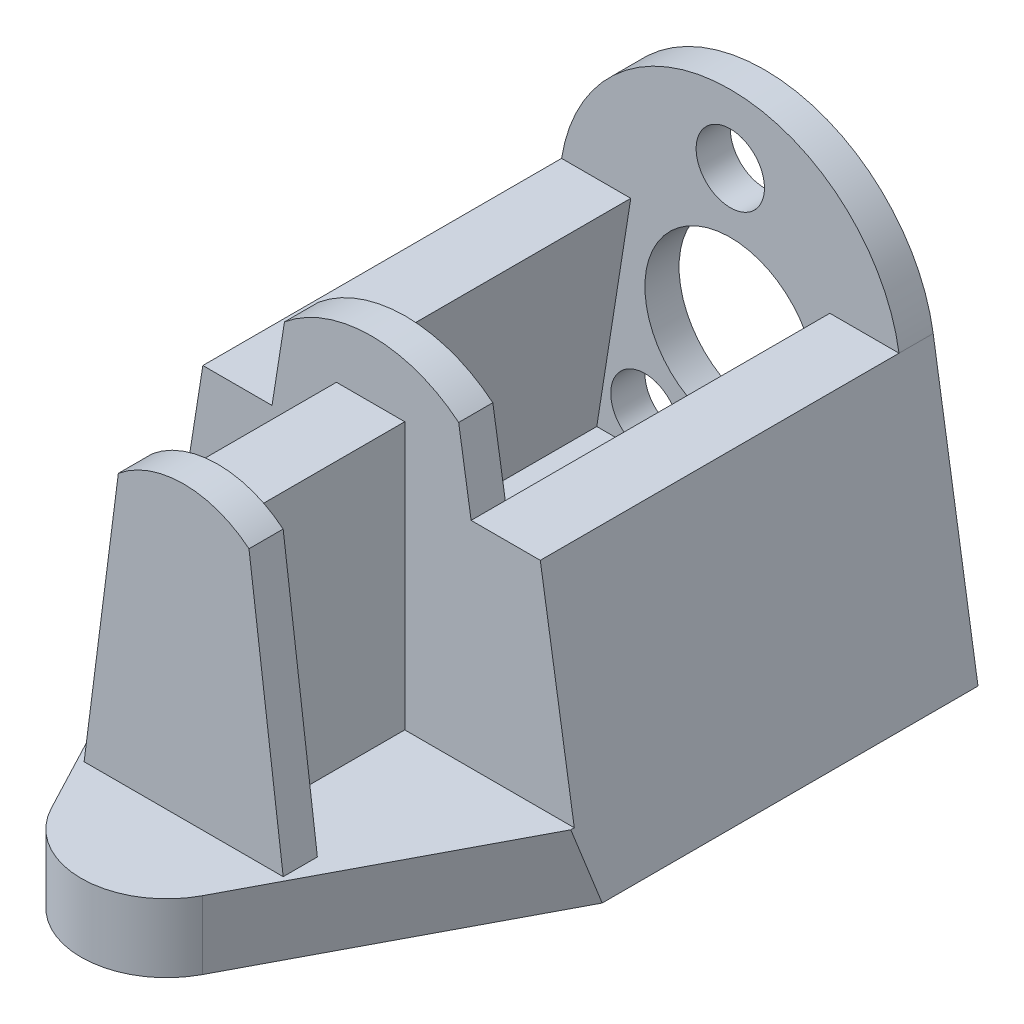
ISO-10303-21;
HEADER;
FILE_DESCRIPTION(('STEP AP214'),'2;1');
FILE_NAME('part.step','',(''),(''),'','','');
FILE_SCHEMA(('AUTOMOTIVE_DESIGN { 1 0 10303 214 1 1 1 1 }'));
ENDSEC;
DATA;
#1=APPLICATION_CONTEXT('core data for automotive mechanical design processes');
#2=APPLICATION_PROTOCOL_DEFINITION('international standard','automotive_design',2000,#1);
#3=PRODUCT_CONTEXT('',#1,'mechanical');
#4=PRODUCT('Part','Part','',(#3));
#5=PRODUCT_RELATED_PRODUCT_CATEGORY('part','',(#4));
#6=PRODUCT_DEFINITION_FORMATION('','',#4);
#7=PRODUCT_DEFINITION_CONTEXT('part definition',#1,'design');
#8=PRODUCT_DEFINITION('design','',#6,#7);
#9=PRODUCT_DEFINITION_SHAPE('','',#8);
#10=(LENGTH_UNIT() NAMED_UNIT(*) SI_UNIT(.MILLI.,.METRE.));
#11=(NAMED_UNIT(*) PLANE_ANGLE_UNIT() SI_UNIT($,.RADIAN.));
#12=(NAMED_UNIT(*) SI_UNIT($,.STERADIAN.) SOLID_ANGLE_UNIT());
#13=UNCERTAINTY_MEASURE_WITH_UNIT(LENGTH_MEASURE(1.E-05),#10,'distance_accuracy_value','');
#14=(GEOMETRIC_REPRESENTATION_CONTEXT(3) GLOBAL_UNCERTAINTY_ASSIGNED_CONTEXT((#13)) GLOBAL_UNIT_ASSIGNED_CONTEXT((#10,
#11,#12)) REPRESENTATION_CONTEXT('',''));
#15=CARTESIAN_POINT('',(0.,0.,0.));
#16=DIRECTION('',(0.,0.,1.));
#17=DIRECTION('',(1.,0.,0.));
#18=AXIS2_PLACEMENT_3D('',#15,#16,#17);
#19=CARTESIAN_POINT('',(11.8665631459995,4.,-23.3179778023443));
#20=DIRECTION('',(0.,-1.,0.));
#21=DIRECTION('',(0.,0.,-1.));
#22=AXIS2_PLACEMENT_3D('',#19,#20,#21);
#23=PLANE('',#22);
#24=DIRECTION('',(0.,0.,1.));
#25=VECTOR('',#24,1.);
#26=CARTESIAN_POINT('',(-2.05764742658131,4.,6.87245404465437));
#27=LINE('',#26,#25);
#28=CARTESIAN_POINT('',(-2.05764742658131,4.,23.));
#29=VERTEX_POINT('',#28);
#30=CARTESIAN_POINT('',(-2.05764742658131,4.,32.));
#31=VERTEX_POINT('',#30);
#32=EDGE_CURVE('E218',#29,#31,#27,.T.);
#33=ORIENTED_EDGE('',*,*,#32,.F.);
#34=DIRECTION('',(1.,0.,0.));
#35=VECTOR('',#34,1.);
#36=CARTESIAN_POINT('',(0.,4.,23.));
#37=LINE('',#36,#35);
#38=CARTESIAN_POINT('',(-11.8665631459995,4.,23.));
#39=VERTEX_POINT('',#38);
#40=EDGE_CURVE('E346',#39,#29,#37,.T.);
#41=ORIENTED_EDGE('',*,*,#40,.F.);
#42=DIRECTION('',(0.,0.,1.));
#43=VECTOR('',#42,1.);
#44=CARTESIAN_POINT('',(-11.8665631459995,4.,-23.3179778023443));
#45=LINE('',#44,#43);
#46=CARTESIAN_POINT('',(-11.8665631459995,4.,23.2023891956157));
#47=VERTEX_POINT('',#46);
#48=EDGE_CURVE('E368',#39,#47,#45,.T.);
#49=ORIENTED_EDGE('',*,*,#48,.T.);
#50=DIRECTION('',(-0.466092369375998,0.,-0.884736064151037));
#51=VECTOR('',#50,1.);
#52=CARTESIAN_POINT('',(-12.5,4.,22.));
#53=LINE('',#52,#51);
#54=CARTESIAN_POINT('',(-4.42368032075518,4.,37.33046184688));
#55=VERTEX_POINT('',#54);
#56=EDGE_CURVE('E316',#55,#47,#53,.T.);
#57=ORIENTED_EDGE('',*,*,#56,.F.);
#58=CARTESIAN_POINT('',(0.,4.,35.));
#59=DIRECTION('',(0.,-1.,0.));
#60=DIRECTION('',(0.,0.,1.));
#61=AXIS2_PLACEMENT_3D('',#58,#59,#60);
#62=CIRCLE('',#61,5.);
#63=CARTESIAN_POINT('',(4.42368032075519,4.,37.33046184688));
#64=VERTEX_POINT('',#63);
#65=EDGE_CURVE('E313',#64,#55,#62,.T.);
#66=ORIENTED_EDGE('',*,*,#65,.F.);
#67=DIRECTION('',(0.466092369375997,0.,-0.884736064151038));
#68=VECTOR('',#67,1.);
#69=CARTESIAN_POINT('',(31.0501077302335,4.,-13.2117957322425));
#70=LINE('',#69,#68);
#71=CARTESIAN_POINT('',(11.8665631459995,4.,23.2023891956157));
#72=VERTEX_POINT('',#71);
#73=EDGE_CURVE('E46',#64,#72,#70,.T.);
#74=ORIENTED_EDGE('',*,*,#73,.T.);
#75=DIRECTION('',(0.,0.,1.));
#76=VECTOR('',#75,1.);
#77=CARTESIAN_POINT('',(11.8665631459995,4.,-23.3179778023443));
#78=LINE('',#77,#76);
#79=CARTESIAN_POINT('',(11.8665631459995,4.,23.));
#80=VERTEX_POINT('',#79);
#81=EDGE_CURVE('E364',#80,#72,#78,.T.);
#82=ORIENTED_EDGE('',*,*,#81,.F.);
#83=CARTESIAN_POINT('',(1.94235257341869,4.,23.));
#84=VERTEX_POINT('',#83);
#85=EDGE_CURVE('E216',#84,#80,#37,.T.);
#86=ORIENTED_EDGE('',*,*,#85,.F.);
#87=DIRECTION('',(0.,0.,1.));
#88=VECTOR('',#87,1.);
#89=CARTESIAN_POINT('',(1.94235257341869,3.99999999999999,6.87245404465437));
#90=LINE('',#89,#88);
#91=CARTESIAN_POINT('',(1.94235257341869,3.99999999999999,32.));
#92=VERTEX_POINT('',#91);
#93=EDGE_CURVE('E214',#84,#92,#90,.T.);
#94=ORIENTED_EDGE('',*,*,#93,.T.);
#95=DIRECTION('',(1.,0.,0.));
#96=VECTOR('',#95,1.);
#97=CARTESIAN_POINT('',(0.,4.,32.));
#98=LINE('',#97,#96);
#99=CARTESIAN_POINT('',(5.82707718181981,4.,32.));
#100=VERTEX_POINT('',#99);
#101=EDGE_CURVE('E198',#92,#100,#98,.T.);
#102=ORIENTED_EDGE('',*,*,#101,.T.);
#103=DIRECTION('',(0.,0.,-1.));
#104=VECTOR('',#103,1.);
#105=CARTESIAN_POINT('',(5.82707718181981,3.99999999999999,34.));
#106=LINE('',#105,#104);
#107=CARTESIAN_POINT('',(5.8270771818198,4.,34.));
#108=VERTEX_POINT('',#107);
#109=EDGE_CURVE('E266',#108,#100,#106,.T.);
#110=ORIENTED_EDGE('',*,*,#109,.F.);
#111=DIRECTION('',(1.,0.,0.));
#112=VECTOR('',#111,1.);
#113=CARTESIAN_POINT('',(0.,4.,34.));
#114=LINE('',#113,#112);
#115=CARTESIAN_POINT('',(-5.82707718181981,4.,34.));
#116=VERTEX_POINT('',#115);
#117=EDGE_CURVE('E251',#116,#108,#114,.T.);
#118=ORIENTED_EDGE('',*,*,#117,.F.);
#119=DIRECTION('',(0.,0.,-1.));
#120=VECTOR('',#119,1.);
#121=CARTESIAN_POINT('',(-5.8270771818198,4.,34.));
#122=LINE('',#121,#120);
#123=CARTESIAN_POINT('',(-5.8270771818198,4.,32.));
#124=VERTEX_POINT('',#123);
#125=EDGE_CURVE('E268',#116,#124,#122,.T.);
#126=ORIENTED_EDGE('',*,*,#125,.T.);
#127=EDGE_CURVE('E209',#124,#31,#98,.T.);
#128=ORIENTED_EDGE('',*,*,#127,.T.);
#129=EDGE_LOOP('',(#33,#41,#49,#57,#66,#74,#82,#86,#94,#102,#110,#118,#126,#128));
#130=FACE_BOUND('',#129,.T.);
#131=ADVANCED_FACE('F38',(#130),#23,.F.);
#132=CARTESIAN_POINT('',(0.,0.,23.));
#133=DIRECTION('',(0.,0.,1.));
#134=DIRECTION('',(1.,0.,0.));
#135=AXIS2_PLACEMENT_3D('',#132,#133,#134);
#136=PLANE('',#135);
#137=ORIENTED_EDGE('',*,*,#40,.T.);
#138=DIRECTION('',(0.,-1.,0.));
#139=VECTOR('',#138,1.);
#140=CARTESIAN_POINT('',(-2.05764742658131,4.,23.));
#141=LINE('',#140,#139);
#142=CARTESIAN_POINT('',(-2.05764742658131,19.6236275730633,23.));
#143=VERTEX_POINT('',#142);
#144=EDGE_CURVE('E53',#143,#29,#141,.T.);
#145=ORIENTED_EDGE('',*,*,#144,.F.);
#146=DIRECTION('',(-1.,0.,0.));
#147=VECTOR('',#146,1.);
#148=CARTESIAN_POINT('',(-2.05764742658131,19.6236275730633,23.));
#149=LINE('',#148,#147);
#150=CARTESIAN_POINT('',(1.94235257341869,19.6236275730633,23.));
#151=VERTEX_POINT('',#150);
#152=EDGE_CURVE('E58',#151,#143,#149,.T.);
#153=ORIENTED_EDGE('',*,*,#152,.F.);
#154=DIRECTION('',(0.,1.,0.));
#155=VECTOR('',#154,1.);
#156=CARTESIAN_POINT('',(1.94235257341869,3.99999999999999,23.));
#157=LINE('',#156,#155);
#158=EDGE_CURVE('E234',#84,#151,#157,.T.);
#159=ORIENTED_EDGE('',*,*,#158,.F.);
#160=ORIENTED_EDGE('',*,*,#85,.T.);
#161=DIRECTION('',(-0.156410158401588,0.987692190081905,0.));
#162=VECTOR('',#161,1.);
#163=CARTESIAN_POINT('',(12.1941982793599,1.93106364878403,23.));
#164=LINE('',#163,#162);
#165=CARTESIAN_POINT('',(9.87692190081905,16.5641015840159,23.));
#166=VERTEX_POINT('',#165);
#167=EDGE_CURVE('E274',#80,#166,#164,.T.);
#168=ORIENTED_EDGE('',*,*,#167,.T.);
#169=DIRECTION('',(-1.,0.,0.));
#170=VECTOR('',#169,1.);
#171=CARTESIAN_POINT('',(0.,16.5641015840159,23.));
#172=LINE('',#171,#170);
#173=CARTESIAN_POINT('',(5.8270771818198,16.5641015840159,23.));
#174=VERTEX_POINT('',#173);
#175=EDGE_CURVE('E276',#166,#174,#172,.T.);
#176=ORIENTED_EDGE('',*,*,#175,.T.);
#177=DIRECTION('',(-0.156410158401588,0.987692190081905,0.));
#178=VECTOR('',#177,1.);
#179=CARTESIAN_POINT('',(8.24342951903225,1.30542301517767,23.));
#180=LINE('',#179,#178);
#181=CARTESIAN_POINT('',(5.09850837718179,21.1648367640844,23.));
#182=VERTEX_POINT('',#181);
#183=EDGE_CURVE('E338',#174,#182,#180,.T.);
#184=ORIENTED_EDGE('',*,*,#183,.T.);
#185=CARTESIAN_POINT('',(0.,15.,23.));
#186=DIRECTION('',(0.,0.,1.));
#187=DIRECTION('',(1.,0.,0.));
#188=AXIS2_PLACEMENT_3D('',#185,#186,#187);
#189=CIRCLE('',#188,8.);
#190=CARTESIAN_POINT('',(-5.09850837718179,21.1648367640844,23.));
#191=VERTEX_POINT('',#190);
#192=EDGE_CURVE('E340',#182,#191,#189,.T.);
#193=ORIENTED_EDGE('',*,*,#192,.T.);
#194=DIRECTION('',(-0.156410158401588,-0.987692190081905,0.));
#195=VECTOR('',#194,1.);
#196=CARTESIAN_POINT('',(-8.24342951903226,1.30542301517767,23.));
#197=LINE('',#196,#195);
#198=CARTESIAN_POINT('',(-5.8270771818198,16.5641015840159,23.));
#199=VERTEX_POINT('',#198);
#200=EDGE_CURVE('E343',#191,#199,#197,.T.);
#201=ORIENTED_EDGE('',*,*,#200,.T.);
#202=DIRECTION('',(1.,0.,0.));
#203=VECTOR('',#202,1.);
#204=CARTESIAN_POINT('',(0.,16.5641015840159,23.));
#205=LINE('',#204,#203);
#206=CARTESIAN_POINT('',(-9.87692190081905,16.5641015840159,23.));
#207=VERTEX_POINT('',#206);
#208=EDGE_CURVE('E293',#207,#199,#205,.T.);
#209=ORIENTED_EDGE('',*,*,#208,.F.);
#210=DIRECTION('',(-0.156410158401588,-0.987692190081905,0.));
#211=VECTOR('',#210,1.);
#212=CARTESIAN_POINT('',(-12.1941982793599,1.93106364878402,23.));
#213=LINE('',#212,#211);
#214=EDGE_CURVE('E296',#207,#39,#213,.T.);
#215=ORIENTED_EDGE('',*,*,#214,.T.);
#216=EDGE_LOOP('',(#137,#145,#153,#159,#160,#168,#176,#184,#193,#201,#209,#215));
#217=FACE_BOUND('',#216,.T.);
#218=ADVANCED_FACE('F449',(#217),#136,.T.);
#219=CARTESIAN_POINT('',(0.,0.,32.));
#220=DIRECTION('',(0.,0.,1.));
#221=DIRECTION('',(1.,0.,0.));
#222=AXIS2_PLACEMENT_3D('',#219,#220,#221);
#223=PLANE('',#222);
#224=DIRECTION('',(0.,1.,0.));
#225=VECTOR('',#224,1.);
#226=CARTESIAN_POINT('',(-2.05764742658131,4.,32.));
#227=LINE('',#226,#225);
#228=CARTESIAN_POINT('',(-2.05764742658131,19.6236275730633,32.));
#229=VERTEX_POINT('',#228);
#230=EDGE_CURVE('E224',#31,#229,#227,.T.);
#231=ORIENTED_EDGE('',*,*,#230,.F.);
#232=ORIENTED_EDGE('',*,*,#127,.F.);
#233=DIRECTION('',(-0.127174729374243,-0.991880329580433,0.));
#234=VECTOR('',#233,1.);
#235=CARTESIAN_POINT('',(-6.237401912962,0.799733472499522,32.));
#236=LINE('',#235,#234);
#237=CARTESIAN_POINT('',(-3.82388128288634,19.6236275730633,32.));
#238=VERTEX_POINT('',#237);
#239=EDGE_CURVE('E210',#238,#124,#236,.T.);
#240=ORIENTED_EDGE('',*,*,#239,.F.);
#241=CARTESIAN_POINT('',(0.,15.,32.));
#242=DIRECTION('',(0.,0.,1.));
#243=DIRECTION('',(1.,0.,0.));
#244=AXIS2_PLACEMENT_3D('',#241,#242,#243);
#245=CIRCLE('',#244,6.);
#246=CARTESIAN_POINT('',(3.82388128288634,19.6236275730633,32.));
#247=VERTEX_POINT('',#246);
#248=EDGE_CURVE('E258',#247,#238,#245,.T.);
#249=ORIENTED_EDGE('',*,*,#248,.F.);
#250=DIRECTION('',(0.127174729374243,-0.991880329580433,0.));
#251=VECTOR('',#250,1.);
#252=CARTESIAN_POINT('',(6.237401912962,0.799733472499522,32.));
#253=LINE('',#252,#251);
#254=EDGE_CURVE('E206',#247,#100,#253,.T.);
#255=ORIENTED_EDGE('',*,*,#254,.T.);
#256=ORIENTED_EDGE('',*,*,#101,.F.);
#257=DIRECTION('',(0.,-1.,0.));
#258=VECTOR('',#257,1.);
#259=CARTESIAN_POINT('',(1.94235257341869,3.99999999999999,32.));
#260=LINE('',#259,#258);
#261=CARTESIAN_POINT('',(1.94235257341869,19.6236275730633,32.));
#262=VERTEX_POINT('',#261);
#263=EDGE_CURVE('E202',#262,#92,#260,.T.);
#264=ORIENTED_EDGE('',*,*,#263,.F.);
#265=DIRECTION('',(1.,0.,0.));
#266=VECTOR('',#265,1.);
#267=CARTESIAN_POINT('',(-2.05764742658131,19.6236275730633,32.));
#268=LINE('',#267,#266);
#269=EDGE_CURVE('E228',#229,#262,#268,.T.);
#270=ORIENTED_EDGE('',*,*,#269,.F.);
#271=EDGE_LOOP('',(#231,#232,#240,#249,#255,#256,#264,#270));
#272=FACE_BOUND('',#271,.T.);
#273=ADVANCED_FACE('F200',(#272),#223,.F.);
#274=DIRECTION('',(1.,0.,0.));
#275=VECTOR('',#274,1.);
#276=CARTESIAN_POINT('',(0.,4.,21.));
#277=LINE('',#276,#275);
#278=CARTESIAN_POINT('',(-7.81671842700026,4.,21.));
#279=VERTEX_POINT('',#278);
#280=CARTESIAN_POINT('',(7.81671842700025,4.,21.));
#281=VERTEX_POINT('',#280);
#282=EDGE_CURVE('E341',#279,#281,#277,.T.);
#283=ORIENTED_EDGE('',*,*,#282,.T.);
#284=DIRECTION('',(0.,0.,-1.));
#285=VECTOR('',#284,1.);
#286=CARTESIAN_POINT('',(7.81671842700024,4.,23.));
#287=LINE('',#286,#285);
#288=CARTESIAN_POINT('',(7.81671842700025,4.,2.));
#289=VERTEX_POINT('',#288);
#290=EDGE_CURVE('E290',#281,#289,#287,.T.);
#291=ORIENTED_EDGE('',*,*,#290,.T.);
#292=DIRECTION('',(-1.,0.,0.));
#293=VECTOR('',#292,1.);
#294=CARTESIAN_POINT('',(11.8665631459995,4.,2.));
#295=LINE('',#294,#293);
#296=CARTESIAN_POINT('',(-7.81671842700026,4.,2.));
#297=VERTEX_POINT('',#296);
#298=EDGE_CURVE('E365',#289,#297,#295,.T.);
#299=ORIENTED_EDGE('',*,*,#298,.T.);
#300=DIRECTION('',(0.,0.,-1.));
#301=VECTOR('',#300,1.);
#302=CARTESIAN_POINT('',(-7.81671842700026,4.,23.));
#303=LINE('',#302,#301);
#304=EDGE_CURVE('E307',#279,#297,#303,.T.);
#305=ORIENTED_EDGE('',*,*,#304,.F.);
#306=EDGE_LOOP('',(#283,#291,#299,#305));
#307=FACE_BOUND('',#306,.T.);
#308=ADVANCED_FACE('F477',(#307),#23,.F.);
#309=CARTESIAN_POINT('',(8.24342951903225,1.30542301517767,23.));
#310=DIRECTION('',(-0.987692190081905,-0.156410158401588,0.));
#311=DIRECTION('',(0.156410158401588,-0.987692190081905,0.));
#312=AXIS2_PLACEMENT_3D('',#309,#310,#311);
#313=PLANE('',#312);
#314=DIRECTION('',(0.,0.,-1.));
#315=VECTOR('',#314,1.);
#316=CARTESIAN_POINT('',(5.8270771818198,16.5641015840159,23.));
#317=LINE('',#316,#315);
#318=CARTESIAN_POINT('',(5.8270771818198,16.5641015840159,21.));
#319=VERTEX_POINT('',#318);
#320=EDGE_CURVE('E284',#174,#319,#317,.T.);
#321=ORIENTED_EDGE('',*,*,#320,.T.);
#322=DIRECTION('',(-0.156410158401588,0.987692190081905,0.));
#323=VECTOR('',#322,1.);
#324=CARTESIAN_POINT('',(8.24342951903225,1.30542301517767,21.));
#325=LINE('',#324,#323);
#326=CARTESIAN_POINT('',(5.09850837718179,21.1648367640844,21.));
#327=VERTEX_POINT('',#326);
#328=EDGE_CURVE('E337',#319,#327,#325,.T.);
#329=ORIENTED_EDGE('',*,*,#328,.T.);
#330=DIRECTION('',(0.,0.,-1.));
#331=VECTOR('',#330,1.);
#332=CARTESIAN_POINT('',(5.09850837718179,21.1648367640844,23.));
#333=LINE('',#332,#331);
#334=EDGE_CURVE('E361',#182,#327,#333,.T.);
#335=ORIENTED_EDGE('',*,*,#334,.F.);
#336=ORIENTED_EDGE('',*,*,#183,.F.);
#337=EDGE_LOOP('',(#321,#329,#335,#336));
#338=FACE_BOUND('',#337,.T.);
#339=ADVANCED_FACE('F485',(#338),#313,.F.);
#340=CARTESIAN_POINT('',(0.,15.,2.));
#341=DIRECTION('',(0.,0.,-1.));
#342=DIRECTION('',(-1.,0.,0.));
#343=AXIS2_PLACEMENT_3D('',#340,#341,#342);
#344=CYLINDRICAL_SURFACE('',#343,10.);
#345=CARTESIAN_POINT('',(0.,15.,0.));
#346=DIRECTION('',(0.,0.,1.));
#347=DIRECTION('',(1.,0.,0.));
#348=AXIS2_PLACEMENT_3D('',#345,#346,#347);
#349=CIRCLE('',#348,10.);
#350=CARTESIAN_POINT('',(9.87692190081905,16.5641015840159,0.));
#351=VERTEX_POINT('',#350);
#352=CARTESIAN_POINT('',(-9.87692190081905,16.5641015840159,0.));
#353=VERTEX_POINT('',#352);
#354=EDGE_CURVE('E389',#351,#353,#349,.T.);
#355=ORIENTED_EDGE('',*,*,#354,.T.);
#356=DIRECTION('',(0.,0.,-1.));
#357=VECTOR('',#356,1.);
#358=CARTESIAN_POINT('',(-9.87692190081905,16.5641015840159,2.));
#359=LINE('',#358,#357);
#360=CARTESIAN_POINT('',(-9.87692190081905,16.5641015840159,2.));
#361=VERTEX_POINT('',#360);
#362=EDGE_CURVE('E414',#361,#353,#359,.T.);
#363=ORIENTED_EDGE('',*,*,#362,.F.);
#364=CARTESIAN_POINT('',(0.,15.,2.));
#365=DIRECTION('',(0.,0.,1.));
#366=DIRECTION('',(1.,0.,0.));
#367=AXIS2_PLACEMENT_3D('',#364,#365,#366);
#368=CIRCLE('',#367,10.);
#369=CARTESIAN_POINT('',(9.87692190081905,16.5641015840159,2.));
#370=VERTEX_POINT('',#369);
#371=EDGE_CURVE('E374',#370,#361,#368,.T.);
#372=ORIENTED_EDGE('',*,*,#371,.F.);
#373=DIRECTION('',(0.,0.,-1.));
#374=VECTOR('',#373,1.);
#375=CARTESIAN_POINT('',(9.87692190081905,16.5641015840159,2.));
#376=LINE('',#375,#374);
#377=EDGE_CURVE('E386',#370,#351,#376,.T.);
#378=ORIENTED_EDGE('',*,*,#377,.T.);
#379=EDGE_LOOP('',(#355,#363,#372,#378));
#380=FACE_BOUND('',#379,.T.);
#381=ADVANCED_FACE('F441',(#380),#344,.T.);
#382=CARTESIAN_POINT('',(-12.1941982793599,1.93106364878402,2.));
#383=DIRECTION('',(-0.987692190081905,0.156410158401588,0.));
#384=DIRECTION('',(-0.156410158401588,-0.987692190081905,0.));
#385=AXIS2_PLACEMENT_3D('',#382,#383,#384);
#386=PLANE('',#385);
#387=DIRECTION('',(0.,0.,-1.));
#388=VECTOR('',#387,1.);
#389=CARTESIAN_POINT('',(-9.87692190081905,16.5641015840159,23.));
#390=LINE('',#389,#388);
#391=EDGE_CURVE('E310',#207,#361,#390,.T.);
#392=ORIENTED_EDGE('',*,*,#391,.T.);
#393=ORIENTED_EDGE('',*,*,#362,.T.);
#394=DIRECTION('',(0.156410158401588,0.987692190081905,0.));
#395=VECTOR('',#394,1.);
#396=CARTESIAN_POINT('',(-12.1941982793599,1.93106364878402,0.));
#397=LINE('',#396,#395);
#398=CARTESIAN_POINT('',(-12.5,0.,0.));
#399=VERTEX_POINT('',#398);
#400=EDGE_CURVE('E392',#399,#353,#397,.T.);
#401=ORIENTED_EDGE('',*,*,#400,.F.);
#402=DIRECTION('',(0.,0.,-1.));
#403=VECTOR('',#402,1.);
#404=CARTESIAN_POINT('',(-12.5,0.,2.));
#405=LINE('',#404,#403);
#406=CARTESIAN_POINT('',(-12.5,0.,22.));
#407=VERTEX_POINT('',#406);
#408=EDGE_CURVE('E412',#407,#399,#405,.T.);
#409=ORIENTED_EDGE('',*,*,#408,.F.);
#410=DIRECTION('',(-0.149941183461306,-0.946842183332683,-0.2846182027981));
#411=VECTOR('',#410,1.);
#412=CARTESIAN_POINT('',(-13.0724903220213,-3.61513744207168,20.9132994497468));
#413=LINE('',#412,#411);
#414=EDGE_CURVE('E335',#47,#407,#413,.T.);
#415=ORIENTED_EDGE('',*,*,#414,.F.);
#416=ORIENTED_EDGE('',*,*,#48,.F.);
#417=ORIENTED_EDGE('',*,*,#214,.F.);
#418=EDGE_LOOP('',(#392,#393,#401,#409,#415,#416,#417));
#419=FACE_BOUND('',#418,.T.);
#420=ADVANCED_FACE('F528',(#419),#386,.T.);
#421=CARTESIAN_POINT('',(0.,0.,2.));
#422=DIRECTION('',(0.,1.,0.));
#423=DIRECTION('',(0.,0.,1.));
#424=AXIS2_PLACEMENT_3D('',#421,#422,#423);
#425=PLANE('',#424);
#426=CARTESIAN_POINT('',(0.,0.,10.));
#427=DIRECTION('',(0.,1.,0.));
#428=DIRECTION('',(0.,0.,1.));
#429=AXIS2_PLACEMENT_3D('',#426,#427,#428);
#430=CIRCLE('',#429,5.);
#431=CARTESIAN_POINT('',(0.,0.,15.));
#432=VERTEX_POINT('',#431);
#433=EDGE_CURVE('E11',#432,#432,#430,.F.);
#434=ORIENTED_EDGE('',*,*,#433,.F.);
#435=EDGE_LOOP('',(#434));
#436=FACE_BOUND('',#435,.T.);
#437=CARTESIAN_POINT('',(0.,0.,35.));
#438=DIRECTION('',(0.,1.,0.));
#439=DIRECTION('',(0.,0.,1.));
#440=AXIS2_PLACEMENT_3D('',#437,#438,#439);
#441=CIRCLE('',#440,5.);
#442=CARTESIAN_POINT('',(4.42368032075519,0.,37.33046184688));
#443=VERTEX_POINT('',#442);
#444=CARTESIAN_POINT('',(-4.42368032075518,0.,37.33046184688));
#445=VERTEX_POINT('',#444);
#446=EDGE_CURVE('E329',#443,#445,#441,.F.);
#447=ORIENTED_EDGE('',*,*,#446,.T.);
#448=DIRECTION('',(-0.466092369375998,0.,-0.884736064151038));
#449=VECTOR('',#448,1.);
#450=CARTESIAN_POINT('',(-18.0318483583694,0.,11.4994510409675));
#451=LINE('',#450,#449);
#452=EDGE_CURVE('E332',#445,#407,#451,.T.);
#453=ORIENTED_EDGE('',*,*,#452,.T.);
#454=ORIENTED_EDGE('',*,*,#408,.T.);
#455=DIRECTION('',(1.,0.,0.));
#456=VECTOR('',#455,1.);
#457=CARTESIAN_POINT('',(0.,0.,0.));
#458=LINE('',#457,#456);
#459=CARTESIAN_POINT('',(12.5,0.,0.));
#460=VERTEX_POINT('',#459);
#461=EDGE_CURVE('E395',#399,#460,#458,.T.);
#462=ORIENTED_EDGE('',*,*,#461,.T.);
#463=DIRECTION('',(0.,0.,-1.));
#464=VECTOR('',#463,1.);
#465=CARTESIAN_POINT('',(12.5,0.,2.));
#466=LINE('',#465,#464);
#467=CARTESIAN_POINT('',(12.5,0.,22.));
#468=VERTEX_POINT('',#467);
#469=EDGE_CURVE('E410',#468,#460,#466,.T.);
#470=ORIENTED_EDGE('',*,*,#469,.F.);
#471=DIRECTION('',(-0.466092369375997,0.,0.884736064151038));
#472=VECTOR('',#471,1.);
#473=CARTESIAN_POINT('',(18.0318483583694,0.,11.4994510409675));
#474=LINE('',#473,#472);
#475=EDGE_CURVE('E326',#468,#443,#474,.T.);
#476=ORIENTED_EDGE('',*,*,#475,.T.);
#477=EDGE_LOOP('',(#447,#453,#454,#462,#470,#476));
#478=FACE_BOUND('',#477,.T.);
#479=ADVANCED_FACE('F429',(#436,#478),#425,.F.);
#480=CARTESIAN_POINT('',(0.,21.,2.));
#481=DIRECTION('',(0.,0.,-1.));
#482=DIRECTION('',(-1.,0.,0.));
#483=AXIS2_PLACEMENT_3D('',#480,#481,#482);
#484=CYLINDRICAL_SURFACE('',#483,2.);
#485=CARTESIAN_POINT('',(0.,21.,2.));
#486=DIRECTION('',(0.,0.,1.));
#487=DIRECTION('',(1.,0.,0.));
#488=AXIS2_PLACEMENT_3D('',#485,#486,#487);
#489=CIRCLE('',#488,2.);
#490=CARTESIAN_POINT('',(2.,21.,2.));
#491=VERTEX_POINT('',#490);
#492=EDGE_CURVE('E380',#491,#491,#489,.T.);
#493=ORIENTED_EDGE('',*,*,#492,.T.);
#494=EDGE_LOOP('',(#493));
#495=FACE_BOUND('',#494,.T.);
#496=CARTESIAN_POINT('',(0.,21.,0.));
#497=DIRECTION('',(0.,0.,1.));
#498=DIRECTION('',(1.,0.,0.));
#499=AXIS2_PLACEMENT_3D('',#496,#497,#498);
#500=CIRCLE('',#499,2.);
#501=CARTESIAN_POINT('',(2.,21.,0.));
#502=VERTEX_POINT('',#501);
#503=EDGE_CURVE('E403',#502,#502,#500,.T.);
#504=ORIENTED_EDGE('',*,*,#503,.F.);
#505=EDGE_LOOP('',(#504));
#506=FACE_BOUND('',#505,.T.);
#507=ADVANCED_FACE('F592',(#495,#506),#484,.F.);
#508=CARTESIAN_POINT('',(5.,6.1,2.));
#509=DIRECTION('',(0.,0.,-1.));
#510=DIRECTION('',(-1.,0.,0.));
#511=AXIS2_PLACEMENT_3D('',#508,#509,#510);
#512=CYLINDRICAL_SURFACE('',#511,2.);
#513=CARTESIAN_POINT('',(5.,6.1,2.));
#514=DIRECTION('',(0.,0.,1.));
#515=DIRECTION('',(1.,0.,0.));
#516=AXIS2_PLACEMENT_3D('',#513,#514,#515);
#517=CIRCLE('',#516,2.);
#518=CARTESIAN_POINT('',(7.,6.1,2.));
#519=VERTEX_POINT('',#518);
#520=EDGE_CURVE('E377',#519,#519,#517,.T.);
#521=ORIENTED_EDGE('',*,*,#520,.T.);
#522=EDGE_LOOP('',(#521));
#523=FACE_BOUND('',#522,.T.);
#524=CARTESIAN_POINT('',(5.,6.1,0.));
#525=DIRECTION('',(0.,0.,1.));
#526=DIRECTION('',(1.,0.,0.));
#527=AXIS2_PLACEMENT_3D('',#524,#525,#526);
#528=CIRCLE('',#527,2.);
#529=CARTESIAN_POINT('',(7.,6.1,0.));
#530=VERTEX_POINT('',#529);
#531=EDGE_CURVE('E400',#530,#530,#528,.T.);
#532=ORIENTED_EDGE('',*,*,#531,.F.);
#533=EDGE_LOOP('',(#532));
#534=FACE_BOUND('',#533,.T.);
#535=ADVANCED_FACE('F595',(#523,#534),#512,.F.);
#536=CARTESIAN_POINT('',(12.1941982793599,1.93106364878403,2.));
#537=DIRECTION('',(-0.987692190081905,-0.156410158401588,0.));
#538=DIRECTION('',(0.156410158401588,-0.987692190081905,0.));
#539=AXIS2_PLACEMENT_3D('',#536,#537,#538);
#540=PLANE('',#539);
#541=ORIENTED_EDGE('',*,*,#377,.F.);
#542=DIRECTION('',(0.,0.,-1.));
#543=VECTOR('',#542,1.);
#544=CARTESIAN_POINT('',(9.87692190081905,16.5641015840159,23.));
#545=LINE('',#544,#543);
#546=EDGE_CURVE('E287',#166,#370,#545,.T.);
#547=ORIENTED_EDGE('',*,*,#546,.F.);
#548=ORIENTED_EDGE('',*,*,#167,.F.);
#549=ORIENTED_EDGE('',*,*,#81,.T.);
#550=DIRECTION('',(0.149941183461306,-0.946842183332683,-0.284618202798101));
#551=VECTOR('',#550,1.);
#552=CARTESIAN_POINT('',(13.0724903220213,-3.61513744207169,20.9132994497468));
#553=LINE('',#552,#551);
#554=EDGE_CURVE('E322',#72,#468,#553,.T.);
#555=ORIENTED_EDGE('',*,*,#554,.T.);
#556=ORIENTED_EDGE('',*,*,#469,.T.);
#557=DIRECTION('',(-0.156410158401588,0.987692190081905,0.));
#558=VECTOR('',#557,1.);
#559=CARTESIAN_POINT('',(12.1941982793599,1.93106364878403,0.));
#560=LINE('',#559,#558);
#561=EDGE_CURVE('E398',#460,#351,#560,.T.);
#562=ORIENTED_EDGE('',*,*,#561,.T.);
#563=EDGE_LOOP('',(#541,#547,#548,#549,#555,#556,#562));
#564=FACE_BOUND('',#563,.T.);
#565=ADVANCED_FACE('F427',(#564),#540,.F.);
#566=CARTESIAN_POINT('',(0.,12.5,2.));
#567=DIRECTION('',(0.,0.,-1.));
#568=DIRECTION('',(-1.,0.,0.));
#569=AXIS2_PLACEMENT_3D('',#566,#567,#568);
#570=CYLINDRICAL_SURFACE('',#569,5.);
#571=CARTESIAN_POINT('',(0.,12.5,2.));
#572=DIRECTION('',(0.,0.,1.));
#573=DIRECTION('',(1.,0.,0.));
#574=AXIS2_PLACEMENT_3D('',#571,#572,#573);
#575=CIRCLE('',#574,5.);
#576=CARTESIAN_POINT('',(5.,12.5,2.));
#577=VERTEX_POINT('',#576);
#578=EDGE_CURVE('E371',#577,#577,#575,.T.);
#579=ORIENTED_EDGE('',*,*,#578,.T.);
#580=EDGE_LOOP('',(#579));
#581=FACE_BOUND('',#580,.T.);
#582=CARTESIAN_POINT('',(0.,12.5,0.));
#583=DIRECTION('',(0.,0.,1.));
#584=DIRECTION('',(1.,0.,0.));
#585=AXIS2_PLACEMENT_3D('',#582,#583,#584);
#586=CIRCLE('',#585,5.);
#587=CARTESIAN_POINT('',(5.,12.5,0.));
#588=VERTEX_POINT('',#587);
#589=EDGE_CURVE('E367',#588,#588,#586,.T.);
#590=ORIENTED_EDGE('',*,*,#589,.F.);
#591=EDGE_LOOP('',(#590));
#592=FACE_BOUND('',#591,.T.);
#593=ADVANCED_FACE('F40',(#581,#592),#570,.F.);
#594=CARTESIAN_POINT('',(-5.,6.1,2.));
#595=DIRECTION('',(0.,0.,-1.));
#596=DIRECTION('',(-1.,0.,0.));
#597=AXIS2_PLACEMENT_3D('',#594,#595,#596);
#598=CYLINDRICAL_SURFACE('',#597,2.);
#599=CARTESIAN_POINT('',(-5.,6.1,2.));
#600=DIRECTION('',(0.,0.,1.));
#601=DIRECTION('',(1.,0.,0.));
#602=AXIS2_PLACEMENT_3D('',#599,#600,#601);
#603=CIRCLE('',#602,2.);
#604=CARTESIAN_POINT('',(-3.,6.1,2.));
#605=VERTEX_POINT('',#604);
#606=EDGE_CURVE('E383',#605,#605,#603,.T.);
#607=ORIENTED_EDGE('',*,*,#606,.T.);
#608=EDGE_LOOP('',(#607));
#609=FACE_BOUND('',#608,.T.);
#610=CARTESIAN_POINT('',(-5.,6.1,0.));
#611=DIRECTION('',(0.,0.,1.));
#612=DIRECTION('',(1.,0.,0.));
#613=AXIS2_PLACEMENT_3D('',#610,#611,#612);
#614=CIRCLE('',#613,2.);
#615=CARTESIAN_POINT('',(-3.,6.1,0.));
#616=VERTEX_POINT('',#615);
#617=EDGE_CURVE('E375',#616,#616,#614,.T.);
#618=ORIENTED_EDGE('',*,*,#617,.F.);
#619=EDGE_LOOP('',(#618));
#620=FACE_BOUND('',#619,.T.);
#621=ADVANCED_FACE('F587',(#609,#620),#598,.F.);
#622=CARTESIAN_POINT('',(0.,0.,2.));
#623=DIRECTION('',(0.,0.,1.));
#624=DIRECTION('',(1.,0.,0.));
#625=AXIS2_PLACEMENT_3D('',#622,#623,#624);
#626=PLANE('',#625);
#627=DIRECTION('',(-0.156410158401588,0.987692190081905,0.));
#628=VECTOR('',#627,1.);
#629=CARTESIAN_POINT('',(8.24342951903225,1.30542301517767,2.));
#630=LINE('',#629,#628);
#631=CARTESIAN_POINT('',(5.8270771818198,16.5641015840159,2.));
#632=VERTEX_POINT('',#631);
#633=EDGE_CURVE('E273',#289,#632,#630,.T.);
#634=ORIENTED_EDGE('',*,*,#633,.T.);
#635=DIRECTION('',(-1.,0.,0.));
#636=VECTOR('',#635,1.);
#637=CARTESIAN_POINT('',(0.,16.5641015840159,2.));
#638=LINE('',#637,#636);
#639=EDGE_CURVE('E277',#370,#632,#638,.T.);
#640=ORIENTED_EDGE('',*,*,#639,.F.);
#641=ORIENTED_EDGE('',*,*,#371,.T.);
#642=DIRECTION('',(1.,0.,0.));
#643=VECTOR('',#642,1.);
#644=CARTESIAN_POINT('',(0.,16.5641015840159,2.));
#645=LINE('',#644,#643);
#646=CARTESIAN_POINT('',(-5.82707718181981,16.5641015840159,2.));
#647=VERTEX_POINT('',#646);
#648=EDGE_CURVE('E292',#361,#647,#645,.T.);
#649=ORIENTED_EDGE('',*,*,#648,.T.);
#650=DIRECTION('',(-0.156410158401588,-0.987692190081905,0.));
#651=VECTOR('',#650,1.);
#652=CARTESIAN_POINT('',(-8.24342951903226,1.30542301517768,2.));
#653=LINE('',#652,#651);
#654=EDGE_CURVE('E297',#647,#297,#653,.T.);
#655=ORIENTED_EDGE('',*,*,#654,.T.);
#656=ORIENTED_EDGE('',*,*,#298,.F.);
#657=EDGE_LOOP('',(#634,#640,#641,#649,#655,#656));
#658=FACE_BOUND('',#657,.T.);
#659=ORIENTED_EDGE('',*,*,#578,.F.);
#660=EDGE_LOOP('',(#659));
#661=FACE_BOUND('',#660,.T.);
#662=ORIENTED_EDGE('',*,*,#520,.F.);
#663=EDGE_LOOP('',(#662));
#664=FACE_BOUND('',#663,.T.);
#665=ORIENTED_EDGE('',*,*,#492,.F.);
#666=EDGE_LOOP('',(#665));
#667=FACE_BOUND('',#666,.T.);
#668=ORIENTED_EDGE('',*,*,#606,.F.);
#669=EDGE_LOOP('',(#668));
#670=FACE_BOUND('',#669,.T.);
#671=ADVANCED_FACE('F505',(#658,#661,#664,#667,#670),#626,.T.);
#672=CARTESIAN_POINT('',(0.,0.,0.));
#673=DIRECTION('',(0.,0.,1.));
#674=DIRECTION('',(1.,0.,0.));
#675=AXIS2_PLACEMENT_3D('',#672,#673,#674);
#676=PLANE('',#675);
#677=ORIENTED_EDGE('',*,*,#589,.T.);
#678=EDGE_LOOP('',(#677));
#679=FACE_BOUND('',#678,.T.);
#680=ORIENTED_EDGE('',*,*,#354,.F.);
#681=ORIENTED_EDGE('',*,*,#561,.F.);
#682=ORIENTED_EDGE('',*,*,#461,.F.);
#683=ORIENTED_EDGE('',*,*,#400,.T.);
#684=EDGE_LOOP('',(#680,#681,#682,#683));
#685=FACE_BOUND('',#684,.T.);
#686=ORIENTED_EDGE('',*,*,#531,.T.);
#687=EDGE_LOOP('',(#686));
#688=FACE_BOUND('',#687,.T.);
#689=ORIENTED_EDGE('',*,*,#503,.T.);
#690=EDGE_LOOP('',(#689));
#691=FACE_BOUND('',#690,.T.);
#692=ORIENTED_EDGE('',*,*,#617,.T.);
#693=EDGE_LOOP('',(#692));
#694=FACE_BOUND('',#693,.T.);
#695=ADVANCED_FACE('F436',(#679,#685,#688,#691,#694),#676,.F.);
#696=CARTESIAN_POINT('',(0.,15.,23.));
#697=DIRECTION('',(0.,0.,-1.));
#698=DIRECTION('',(-1.,0.,0.));
#699=AXIS2_PLACEMENT_3D('',#696,#697,#698);
#700=CYLINDRICAL_SURFACE('',#699,8.);
#701=CARTESIAN_POINT('',(0.,15.,21.));
#702=DIRECTION('',(0.,0.,1.));
#703=DIRECTION('',(1.,0.,0.));
#704=AXIS2_PLACEMENT_3D('',#701,#702,#703);
#705=CIRCLE('',#704,8.);
#706=CARTESIAN_POINT('',(-5.09850837718179,21.1648367640844,21.));
#707=VERTEX_POINT('',#706);
#708=EDGE_CURVE('E352',#327,#707,#705,.T.);
#709=ORIENTED_EDGE('',*,*,#708,.T.);
#710=DIRECTION('',(0.,0.,-1.));
#711=VECTOR('',#710,1.);
#712=CARTESIAN_POINT('',(-5.09850837718179,21.1648367640844,23.));
#713=LINE('',#712,#711);
#714=EDGE_CURVE('E348',#191,#707,#713,.T.);
#715=ORIENTED_EDGE('',*,*,#714,.F.);
#716=ORIENTED_EDGE('',*,*,#192,.F.);
#717=ORIENTED_EDGE('',*,*,#334,.T.);
#718=EDGE_LOOP('',(#709,#715,#716,#717));
#719=FACE_BOUND('',#718,.T.);
#720=ADVANCED_FACE('F520',(#719),#700,.T.);
#721=CARTESIAN_POINT('',(-8.24342951903226,1.30542301517767,23.));
#722=DIRECTION('',(0.987692190081905,-0.156410158401588,0.));
#723=DIRECTION('',(0.156410158401588,0.987692190081905,0.));
#724=AXIS2_PLACEMENT_3D('',#721,#722,#723);
#725=PLANE('',#724);
#726=DIRECTION('',(-0.156410158401588,-0.987692190081905,0.));
#727=VECTOR('',#726,1.);
#728=CARTESIAN_POINT('',(-8.24342951903226,1.30542301517767,21.));
#729=LINE('',#728,#727);
#730=CARTESIAN_POINT('',(-5.8270771818198,16.5641015840159,21.));
#731=VERTEX_POINT('',#730);
#732=EDGE_CURVE('E355',#707,#731,#729,.T.);
#733=ORIENTED_EDGE('',*,*,#732,.T.);
#734=DIRECTION('',(0.,0.,-1.));
#735=VECTOR('',#734,1.);
#736=CARTESIAN_POINT('',(-5.82707718181981,16.5641015840159,23.));
#737=LINE('',#736,#735);
#738=EDGE_CURVE('E304',#199,#731,#737,.T.);
#739=ORIENTED_EDGE('',*,*,#738,.F.);
#740=ORIENTED_EDGE('',*,*,#200,.F.);
#741=ORIENTED_EDGE('',*,*,#714,.T.);
#742=EDGE_LOOP('',(#733,#739,#740,#741));
#743=FACE_BOUND('',#742,.T.);
#744=ADVANCED_FACE('F515',(#743),#725,.F.);
#745=CARTESIAN_POINT('',(0.,0.,21.));
#746=DIRECTION('',(0.,0.,1.));
#747=DIRECTION('',(1.,0.,0.));
#748=AXIS2_PLACEMENT_3D('',#745,#746,#747);
#749=PLANE('',#748);
#750=EDGE_CURVE('E349',#281,#319,#325,.T.);
#751=ORIENTED_EDGE('',*,*,#750,.F.);
#752=ORIENTED_EDGE('',*,*,#282,.F.);
#753=EDGE_CURVE('E354',#731,#279,#729,.T.);
#754=ORIENTED_EDGE('',*,*,#753,.F.);
#755=ORIENTED_EDGE('',*,*,#732,.F.);
#756=ORIENTED_EDGE('',*,*,#708,.F.);
#757=ORIENTED_EDGE('',*,*,#328,.F.);
#758=EDGE_LOOP('',(#751,#752,#754,#755,#756,#757));
#759=FACE_BOUND('',#758,.T.);
#760=ADVANCED_FACE('F499',(#759),#749,.F.);
#761=CARTESIAN_POINT('',(-12.5,-32.,22.));
#762=DIRECTION('',(0.884736064151037,0.,-0.466092369375998));
#763=DIRECTION('',(-0.466092369375998,0.,-0.884736064151038));
#764=AXIS2_PLACEMENT_3D('',#761,#762,#763);
#765=PLANE('',#764);
#766=ORIENTED_EDGE('',*,*,#414,.T.);
#767=ORIENTED_EDGE('',*,*,#452,.F.);
#768=DIRECTION('',(0.,1.,0.));
#769=VECTOR('',#768,1.);
#770=CARTESIAN_POINT('',(-4.42368032075518,-32.,37.33046184688));
#771=LINE('',#770,#769);
#772=EDGE_CURVE('E320',#445,#55,#771,.T.);
#773=ORIENTED_EDGE('',*,*,#772,.T.);
#774=ORIENTED_EDGE('',*,*,#56,.T.);
#775=EDGE_LOOP('',(#766,#767,#773,#774));
#776=FACE_BOUND('',#775,.T.);
#777=ADVANCED_FACE('F564',(#776),#765,.F.);
#778=CARTESIAN_POINT('',(0.,-32.,35.));
#779=DIRECTION('',(0.,1.,0.));
#780=DIRECTION('',(0.,0.,1.));
#781=AXIS2_PLACEMENT_3D('',#778,#779,#780);
#782=CYLINDRICAL_SURFACE('',#781,5.);
#783=DIRECTION('',(0.,1.,0.));
#784=VECTOR('',#783,1.);
#785=CARTESIAN_POINT('',(4.42368032075519,-32.,37.33046184688));
#786=LINE('',#785,#784);
#787=EDGE_CURVE('E319',#443,#64,#786,.T.);
#788=ORIENTED_EDGE('',*,*,#787,.T.);
#789=ORIENTED_EDGE('',*,*,#65,.T.);
#790=ORIENTED_EDGE('',*,*,#772,.F.);
#791=ORIENTED_EDGE('',*,*,#446,.F.);
#792=EDGE_LOOP('',(#788,#789,#790,#791));
#793=FACE_BOUND('',#792,.T.);
#794=ADVANCED_FACE('F567',(#793),#782,.T.);
#795=CARTESIAN_POINT('',(12.5,-32.,22.));
#796=DIRECTION('',(-0.884736064151038,0.,-0.466092369375997));
#797=DIRECTION('',(-0.466092369375997,0.,0.884736064151038));
#798=AXIS2_PLACEMENT_3D('',#795,#796,#797);
#799=PLANE('',#798);
#800=ORIENTED_EDGE('',*,*,#554,.F.);
#801=ORIENTED_EDGE('',*,*,#73,.F.);
#802=ORIENTED_EDGE('',*,*,#787,.F.);
#803=ORIENTED_EDGE('',*,*,#475,.F.);
#804=EDGE_LOOP('',(#800,#801,#802,#803));
#805=FACE_BOUND('',#804,.T.);
#806=ADVANCED_FACE('F423',(#805),#799,.F.);
#807=CARTESIAN_POINT('',(-8.24342951903226,1.30542301517768,23.));
#808=DIRECTION('',(0.987692190081905,-0.156410158401588,0.));
#809=DIRECTION('',(0.156410158401588,0.987692190081905,0.));
#810=AXIS2_PLACEMENT_3D('',#807,#808,#809);
#811=PLANE('',#810);
#812=ORIENTED_EDGE('',*,*,#753,.T.);
#813=ORIENTED_EDGE('',*,*,#304,.T.);
#814=ORIENTED_EDGE('',*,*,#654,.F.);
#815=EDGE_CURVE('E300',#731,#647,#737,.T.);
#816=ORIENTED_EDGE('',*,*,#815,.F.);
#817=EDGE_LOOP('',(#812,#813,#814,#816));
#818=FACE_BOUND('',#817,.T.);
#819=ADVANCED_FACE('F512',(#818),#811,.T.);
#820=CARTESIAN_POINT('',(0.,16.5641015840159,23.));
#821=DIRECTION('',(0.,1.,0.));
#822=DIRECTION('',(-1.,0.,0.));
#823=AXIS2_PLACEMENT_3D('',#820,#821,#822);
#824=PLANE('',#823);
#825=ORIENTED_EDGE('',*,*,#648,.F.);
#826=ORIENTED_EDGE('',*,*,#391,.F.);
#827=ORIENTED_EDGE('',*,*,#208,.T.);
#828=ORIENTED_EDGE('',*,*,#738,.T.);
#829=ORIENTED_EDGE('',*,*,#815,.T.);
#830=EDGE_LOOP('',(#825,#826,#827,#828,#829));
#831=FACE_BOUND('',#830,.T.);
#832=ADVANCED_FACE('F524',(#831),#824,.T.);
#833=CARTESIAN_POINT('',(8.24342951903225,1.30542301517767,23.));
#834=DIRECTION('',(-0.987692190081905,-0.156410158401588,0.));
#835=DIRECTION('',(0.156410158401588,-0.987692190081905,0.));
#836=AXIS2_PLACEMENT_3D('',#833,#834,#835);
#837=PLANE('',#836);
#838=ORIENTED_EDGE('',*,*,#750,.T.);
#839=EDGE_CURVE('E280',#319,#632,#317,.T.);
#840=ORIENTED_EDGE('',*,*,#839,.T.);
#841=ORIENTED_EDGE('',*,*,#633,.F.);
#842=ORIENTED_EDGE('',*,*,#290,.F.);
#843=EDGE_LOOP('',(#838,#840,#841,#842));
#844=FACE_BOUND('',#843,.T.);
#845=ADVANCED_FACE('F504',(#844),#837,.T.);
#846=CARTESIAN_POINT('',(0.,16.5641015840159,23.));
#847=DIRECTION('',(0.,-1.,0.));
#848=DIRECTION('',(1.,0.,0.));
#849=AXIS2_PLACEMENT_3D('',#846,#847,#848);
#850=PLANE('',#849);
#851=ORIENTED_EDGE('',*,*,#639,.T.);
#852=ORIENTED_EDGE('',*,*,#839,.F.);
#853=ORIENTED_EDGE('',*,*,#320,.F.);
#854=ORIENTED_EDGE('',*,*,#175,.F.);
#855=ORIENTED_EDGE('',*,*,#546,.T.);
#856=EDGE_LOOP('',(#851,#852,#853,#854,#855));
#857=FACE_BOUND('',#856,.T.);
#858=ADVANCED_FACE('F446',(#857),#850,.F.);
#859=CARTESIAN_POINT('',(0.,15.,34.));
#860=DIRECTION('',(0.,0.,-1.));
#861=DIRECTION('',(-1.,0.,0.));
#862=AXIS2_PLACEMENT_3D('',#859,#860,#861);
#863=CYLINDRICAL_SURFACE('',#862,6.);
#864=ORIENTED_EDGE('',*,*,#248,.T.);
#865=DIRECTION('',(0.,0.,-1.));
#866=VECTOR('',#865,1.);
#867=CARTESIAN_POINT('',(-3.82388128288634,19.6236275730633,34.));
#868=LINE('',#867,#866);
#869=CARTESIAN_POINT('',(-3.82388128288634,19.6236275730633,34.));
#870=VERTEX_POINT('',#869);
#871=EDGE_CURVE('E270',#870,#238,#868,.T.);
#872=ORIENTED_EDGE('',*,*,#871,.F.);
#873=CARTESIAN_POINT('',(0.,15.,34.));
#874=DIRECTION('',(0.,0.,1.));
#875=DIRECTION('',(1.,0.,0.));
#876=AXIS2_PLACEMENT_3D('',#873,#874,#875);
#877=CIRCLE('',#876,6.);
#878=CARTESIAN_POINT('',(3.82388128288634,19.6236275730633,34.));
#879=VERTEX_POINT('',#878);
#880=EDGE_CURVE('E245',#879,#870,#877,.T.);
#881=ORIENTED_EDGE('',*,*,#880,.F.);
#882=DIRECTION('',(0.,0.,-1.));
#883=VECTOR('',#882,1.);
#884=CARTESIAN_POINT('',(3.82388128288634,19.6236275730633,34.));
#885=LINE('',#884,#883);
#886=EDGE_CURVE('E257',#879,#247,#885,.T.);
#887=ORIENTED_EDGE('',*,*,#886,.T.);
#888=EDGE_LOOP('',(#864,#872,#881,#887));
#889=FACE_BOUND('',#888,.T.);
#890=ADVANCED_FACE('F551',(#889),#863,.T.);
#891=CARTESIAN_POINT('',(-6.237401912962,0.799733472499522,34.));
#892=DIRECTION('',(0.991880329580433,-0.127174729374243,0.));
#893=DIRECTION('',(0.127174729374243,0.991880329580433,0.));
#894=AXIS2_PLACEMENT_3D('',#891,#892,#893);
#895=PLANE('',#894);
#896=ORIENTED_EDGE('',*,*,#239,.T.);
#897=ORIENTED_EDGE('',*,*,#125,.F.);
#898=DIRECTION('',(-0.127174729374243,-0.991880329580433,0.));
#899=VECTOR('',#898,1.);
#900=CARTESIAN_POINT('',(-6.237401912962,0.799733472499522,34.));
#901=LINE('',#900,#899);
#902=EDGE_CURVE('E248',#870,#116,#901,.T.);
#903=ORIENTED_EDGE('',*,*,#902,.F.);
#904=ORIENTED_EDGE('',*,*,#871,.T.);
#905=EDGE_LOOP('',(#896,#897,#903,#904));
#906=FACE_BOUND('',#905,.T.);
#907=ADVANCED_FACE('F547',(#906),#895,.F.);
#908=CARTESIAN_POINT('',(6.237401912962,0.799733472499522,34.));
#909=DIRECTION('',(0.991880329580433,0.127174729374243,0.));
#910=DIRECTION('',(-0.127174729374243,0.991880329580433,0.));
#911=AXIS2_PLACEMENT_3D('',#908,#909,#910);
#912=PLANE('',#911);
#913=ORIENTED_EDGE('',*,*,#254,.F.);
#914=ORIENTED_EDGE('',*,*,#886,.F.);
#915=DIRECTION('',(0.127174729374243,-0.991880329580433,0.));
#916=VECTOR('',#915,1.);
#917=CARTESIAN_POINT('',(6.237401912962,0.799733472499522,34.));
#918=LINE('',#917,#916);
#919=EDGE_CURVE('E254',#879,#108,#918,.T.);
#920=ORIENTED_EDGE('',*,*,#919,.T.);
#921=ORIENTED_EDGE('',*,*,#109,.T.);
#922=EDGE_LOOP('',(#913,#914,#920,#921));
#923=FACE_BOUND('',#922,.T.);
#924=ADVANCED_FACE('F541',(#923),#912,.T.);
#925=CARTESIAN_POINT('',(0.,0.,34.));
#926=DIRECTION('',(0.,0.,1.));
#927=DIRECTION('',(1.,0.,0.));
#928=AXIS2_PLACEMENT_3D('',#925,#926,#927);
#929=PLANE('',#928);
#930=ORIENTED_EDGE('',*,*,#880,.T.);
#931=ORIENTED_EDGE('',*,*,#902,.T.);
#932=ORIENTED_EDGE('',*,*,#117,.T.);
#933=ORIENTED_EDGE('',*,*,#919,.F.);
#934=EDGE_LOOP('',(#930,#931,#932,#933));
#935=FACE_BOUND('',#934,.T.);
#936=ADVANCED_FACE('F534',(#935),#929,.T.);
#937=CARTESIAN_POINT('',(-2.05764742658131,19.6236275730633,6.87245404465437));
#938=DIRECTION('',(0.,-1.,0.));
#939=DIRECTION('',(0.,0.,-1.));
#940=AXIS2_PLACEMENT_3D('',#937,#938,#939);
#941=PLANE('',#940);
#942=DIRECTION('',(0.,0.,1.));
#943=VECTOR('',#942,1.);
#944=CARTESIAN_POINT('',(1.94235257341869,19.6236275730633,6.87245404465437));
#945=LINE('',#944,#943);
#946=EDGE_CURVE('E222',#151,#262,#945,.T.);
#947=ORIENTED_EDGE('',*,*,#946,.F.);
#948=ORIENTED_EDGE('',*,*,#152,.T.);
#949=DIRECTION('',(0.,0.,1.));
#950=VECTOR('',#949,1.);
#951=CARTESIAN_POINT('',(-2.05764742658131,19.6236275730633,6.87245404465437));
#952=LINE('',#951,#950);
#953=EDGE_CURVE('E239',#143,#229,#952,.T.);
#954=ORIENTED_EDGE('',*,*,#953,.T.);
#955=ORIENTED_EDGE('',*,*,#269,.T.);
#956=EDGE_LOOP('',(#947,#948,#954,#955));
#957=FACE_BOUND('',#956,.T.);
#958=ADVANCED_FACE('F532',(#957),#941,.F.);
#959=CARTESIAN_POINT('',(-2.05764742658131,4.,6.87245404465437));
#960=DIRECTION('',(1.,0.,0.));
#961=DIRECTION('',(0.,0.,-1.));
#962=AXIS2_PLACEMENT_3D('',#959,#960,#961);
#963=PLANE('',#962);
#964=ORIENTED_EDGE('',*,*,#953,.F.);
#965=ORIENTED_EDGE('',*,*,#144,.T.);
#966=ORIENTED_EDGE('',*,*,#32,.T.);
#967=ORIENTED_EDGE('',*,*,#230,.T.);
#968=EDGE_LOOP('',(#964,#965,#966,#967));
#969=FACE_BOUND('',#968,.T.);
#970=ADVANCED_FACE('F472',(#969),#963,.F.);
#971=CARTESIAN_POINT('',(1.94235257341869,3.99999999999999,6.87245404465437));
#972=DIRECTION('',(-1.,0.,0.));
#973=DIRECTION('',(0.,-1.,0.));
#974=AXIS2_PLACEMENT_3D('',#971,#972,#973);
#975=PLANE('',#974);
#976=ORIENTED_EDGE('',*,*,#93,.F.);
#977=ORIENTED_EDGE('',*,*,#158,.T.);
#978=ORIENTED_EDGE('',*,*,#946,.T.);
#979=ORIENTED_EDGE('',*,*,#263,.T.);
#980=EDGE_LOOP('',(#976,#977,#978,#979));
#981=FACE_BOUND('',#980,.T.);
#982=ADVANCED_FACE('F220',(#981),#975,.F.);
#983=CARTESIAN_POINT('',(0.,-5.,10.));
#984=DIRECTION('',(0.,-1.,0.));
#985=DIRECTION('',(0.,0.,-1.));
#986=AXIS2_PLACEMENT_3D('',#983,#984,#985);
#987=PLANE('',#986);
#988=CARTESIAN_POINT('',(0.,-5.,10.));
#989=DIRECTION('',(0.,-1.,0.));
#990=DIRECTION('',(0.,0.,-1.));
#991=AXIS2_PLACEMENT_3D('',#988,#989,#990);
#992=CIRCLE('',#991,5.);
#993=CARTESIAN_POINT('',(0.,-5.,5.));
#994=VERTEX_POINT('',#993);
#995=EDGE_CURVE('E225',#994,#994,#992,.T.);
#996=ORIENTED_EDGE('',*,*,#995,.T.);
#997=EDGE_LOOP('',(#996));
#998=FACE_BOUND('',#997,.T.);
#999=CARTESIAN_POINT('',(0.,-5.,10.));
#1000=DIRECTION('',(0.,-1.,0.));
#1001=DIRECTION('',(0.,0.,-1.));
#1002=AXIS2_PLACEMENT_3D('',#999,#1000,#1001);
#1003=CIRCLE('',#1002,2.5);
#1004=CARTESIAN_POINT('',(0.,-5.,7.5));
#1005=VERTEX_POINT('',#1004);
#1006=EDGE_CURVE('E231',#1005,#1005,#1003,.T.);
#1007=ORIENTED_EDGE('',*,*,#1006,.F.);
#1008=EDGE_LOOP('',(#1007));
#1009=FACE_BOUND('',#1008,.T.);
#1010=ADVANCED_FACE('F461',(#998,#1009),#987,.T.);
#1011=CARTESIAN_POINT('',(0.,-5.,10.));
#1012=DIRECTION('',(0.,1.,0.));
#1013=DIRECTION('',(0.,0.,1.));
#1014=AXIS2_PLACEMENT_3D('',#1011,#1012,#1013);
#1015=CYLINDRICAL_SURFACE('',#1014,5.);
#1016=ORIENTED_EDGE('',*,*,#995,.F.);
#1017=EDGE_LOOP('',(#1016));
#1018=FACE_BOUND('',#1017,.T.);
#1019=ORIENTED_EDGE('',*,*,#433,.T.);
#1020=EDGE_LOOP('',(#1019));
#1021=FACE_BOUND('',#1020,.T.);
#1022=ADVANCED_FACE('F463',(#1018,#1021),#1015,.T.);
#1023=CARTESIAN_POINT('',(0.,-5.,10.));
#1024=DIRECTION('',(0.,1.,0.));
#1025=DIRECTION('',(0.,0.,1.));
#1026=AXIS2_PLACEMENT_3D('',#1023,#1024,#1025);
#1027=CYLINDRICAL_SURFACE('',#1026,2.5);
#1028=ORIENTED_EDGE('',*,*,#1006,.T.);
#1029=EDGE_LOOP('',(#1028));
#1030=FACE_BOUND('',#1029,.T.);
#1031=CARTESIAN_POINT('',(0.,0.,10.));
#1032=DIRECTION('',(0.,-1.,0.));
#1033=DIRECTION('',(0.,0.,-1.));
#1034=AXIS2_PLACEMENT_3D('',#1031,#1032,#1033);
#1035=CIRCLE('',#1034,2.5);
#1036=CARTESIAN_POINT('',(0.,0.,7.5));
#1037=VERTEX_POINT('',#1036);
#1038=EDGE_CURVE('E452',#1037,#1037,#1035,.T.);
#1039=ORIENTED_EDGE('',*,*,#1038,.F.);
#1040=EDGE_LOOP('',(#1039));
#1041=FACE_BOUND('',#1040,.T.);
#1042=ADVANCED_FACE('F458',(#1030,#1041),#1027,.F.);
#1043=ORIENTED_EDGE('',*,*,#1038,.T.);
#1044=EDGE_LOOP('',(#1043));
#1045=FACE_BOUND('',#1044,.T.);
#1046=ADVANCED_FACE('F605',(#1045),#425,.F.);
#1047=CLOSED_SHELL('',(#131,#218,#273,#308,#339,#381,#420,#479,#507,#535,#565,#593,#621,#671,
#695,#720,#744,#760,#777,#794,#806,#819,#832,#845,#858,#890,#907,#924,#936,#958,#970,#982,#1010,
#1022,#1042,#1046));
#1048=MANIFOLD_SOLID_BREP('B2',#1047);
#1049=ADVANCED_BREP_SHAPE_REPRESENTATION('',(#18,#1048),#14);
#1050=SHAPE_DEFINITION_REPRESENTATION(#9,#1049);
ENDSEC;
END-ISO-10303-21;
